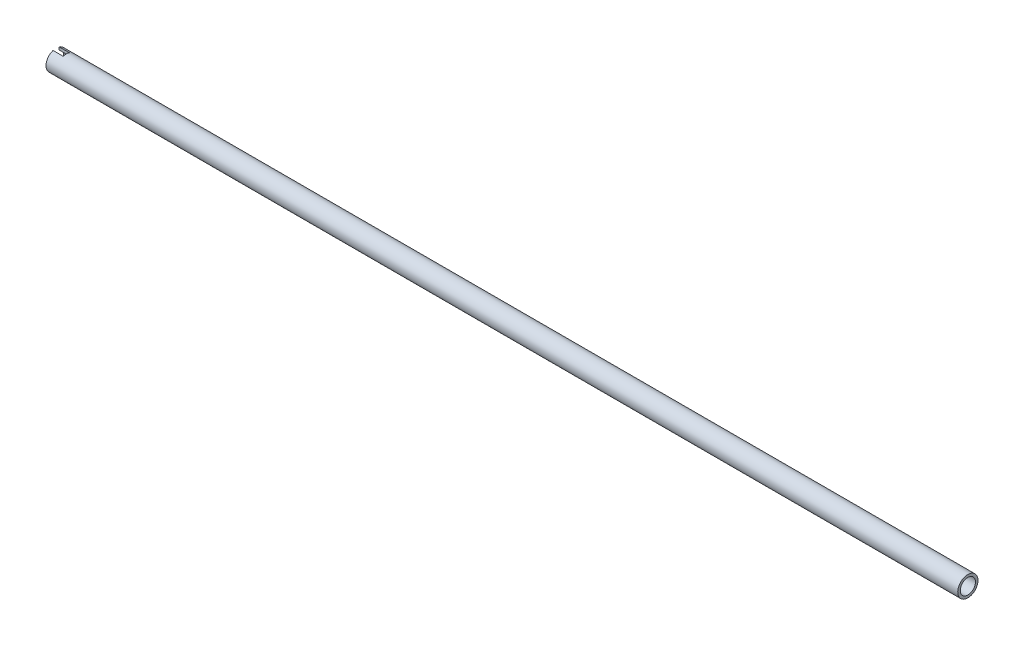
ISO-10303-21;
HEADER;
FILE_DESCRIPTION(('STEP AP214'),'2;1');
FILE_NAME('part.step','',(''),(''),'','','');
FILE_SCHEMA(('AUTOMOTIVE_DESIGN { 1 0 10303 214 1 1 1 1 }'));
ENDSEC;
DATA;
#1=APPLICATION_CONTEXT('core data for automotive mechanical design processes');
#2=APPLICATION_PROTOCOL_DEFINITION('international standard','automotive_design',2000,#1);
#3=PRODUCT_CONTEXT('',#1,'mechanical');
#4=PRODUCT('Part','Part','',(#3));
#5=PRODUCT_RELATED_PRODUCT_CATEGORY('part','',(#4));
#6=PRODUCT_DEFINITION_FORMATION('','',#4);
#7=PRODUCT_DEFINITION_CONTEXT('part definition',#1,'design');
#8=PRODUCT_DEFINITION('design','',#6,#7);
#9=PRODUCT_DEFINITION_SHAPE('','',#8);
#10=(LENGTH_UNIT() NAMED_UNIT(*) SI_UNIT(.MILLI.,.METRE.));
#11=(NAMED_UNIT(*) PLANE_ANGLE_UNIT() SI_UNIT($,.RADIAN.));
#12=(NAMED_UNIT(*) SI_UNIT($,.STERADIAN.) SOLID_ANGLE_UNIT());
#13=UNCERTAINTY_MEASURE_WITH_UNIT(LENGTH_MEASURE(1.E-05),#10,'distance_accuracy_value','');
#14=(GEOMETRIC_REPRESENTATION_CONTEXT(3) GLOBAL_UNCERTAINTY_ASSIGNED_CONTEXT((#13)) GLOBAL_UNIT_ASSIGNED_CONTEXT((#10,
#11,#12)) REPRESENTATION_CONTEXT('',''));
#15=CARTESIAN_POINT('',(0.,0.,0.));
#16=DIRECTION('',(0.,0.,1.));
#17=DIRECTION('',(1.,0.,0.));
#18=AXIS2_PLACEMENT_3D('',#15,#16,#17);
#19=CARTESIAN_POINT('',(90.,0.,0.));
#20=DIRECTION('',(1.,0.,0.));
#21=DIRECTION('',(0.,0.,-1.));
#22=AXIS2_PLACEMENT_3D('',#19,#20,#21);
#23=PLANE('',#22);
#24=CARTESIAN_POINT('',(90.,0.,0.));
#25=DIRECTION('',(1.,0.,0.));
#26=DIRECTION('',(0.,0.,-1.));
#27=AXIS2_PLACEMENT_3D('',#24,#25,#26);
#28=CIRCLE('',#27,1.);
#29=CARTESIAN_POINT('',(90.,0.,-1.));
#30=VERTEX_POINT('',#29);
#31=EDGE_CURVE('E101',#30,#30,#28,.T.);
#32=ORIENTED_EDGE('',*,*,#31,.T.);
#33=EDGE_LOOP('',(#32));
#34=FACE_BOUND('',#33,.T.);
#35=CARTESIAN_POINT('',(90.,0.,0.));
#36=DIRECTION('',(1.,0.,0.));
#37=DIRECTION('',(0.,0.,-1.));
#38=AXIS2_PLACEMENT_3D('',#35,#36,#37);
#39=CIRCLE('',#38,0.75);
#40=CARTESIAN_POINT('',(90.,0.,-0.75));
#41=VERTEX_POINT('',#40);
#42=EDGE_CURVE('E93',#41,#41,#39,.T.);
#43=ORIENTED_EDGE('',*,*,#42,.F.);
#44=EDGE_LOOP('',(#43));
#45=FACE_BOUND('',#44,.T.);
#46=ADVANCED_FACE('F33',(#34,#45),#23,.T.);
#47=CARTESIAN_POINT('',(0.,0.,0.));
#48=DIRECTION('',(1.,0.,0.));
#49=DIRECTION('',(0.,0.,-1.));
#50=AXIS2_PLACEMENT_3D('',#47,#48,#49);
#51=PLANE('',#50);
#52=CARTESIAN_POINT('',(0.,0.,0.));
#53=DIRECTION('',(1.,0.,0.));
#54=DIRECTION('',(0.,0.,-1.));
#55=AXIS2_PLACEMENT_3D('',#52,#53,#54);
#56=CIRCLE('',#55,0.75);
#57=CARTESIAN_POINT('',(0.,0.685626720599482,0.304));
#58=VERTEX_POINT('',#57);
#59=CARTESIAN_POINT('',(0.,0.685626720599482,-0.304));
#60=VERTEX_POINT('',#59);
#61=EDGE_CURVE('E85',#58,#60,#56,.T.);
#62=ORIENTED_EDGE('',*,*,#61,.T.);
#63=DIRECTION('',(0.,-1.,0.));
#64=VECTOR('',#63,1.);
#65=CARTESIAN_POINT('',(0.,0.610565491882027,-0.304));
#66=LINE('',#65,#64);
#67=CARTESIAN_POINT('',(0.,0.952672031708709,-0.304));
#68=VERTEX_POINT('',#67);
#69=EDGE_CURVE('E88',#68,#60,#66,.T.);
#70=ORIENTED_EDGE('',*,*,#69,.F.);
#71=CARTESIAN_POINT('',(0.,0.,0.));
#72=DIRECTION('',(1.,0.,0.));
#73=DIRECTION('',(0.,0.,-1.));
#74=AXIS2_PLACEMENT_3D('',#71,#72,#73);
#75=CIRCLE('',#74,1.);
#76=CARTESIAN_POINT('',(0.,0.952672031708709,0.304));
#77=VERTEX_POINT('',#76);
#78=EDGE_CURVE('E87',#77,#68,#75,.T.);
#79=ORIENTED_EDGE('',*,*,#78,.F.);
#80=DIRECTION('',(0.,1.,0.));
#81=VECTOR('',#80,1.);
#82=CARTESIAN_POINT('',(0.,1.09920253711593,0.304));
#83=LINE('',#82,#81);
#84=EDGE_CURVE('E74',#58,#77,#83,.T.);
#85=ORIENTED_EDGE('',*,*,#84,.F.);
#86=EDGE_LOOP('',(#62,#70,#79,#85));
#87=FACE_BOUND('',#86,.T.);
#88=ADVANCED_FACE('F83',(#87),#51,.F.);
#89=CARTESIAN_POINT('',(90.,0.,0.));
#90=DIRECTION('',(-1.,0.,0.));
#91=DIRECTION('',(0.,0.,1.));
#92=AXIS2_PLACEMENT_3D('',#89,#90,#91);
#93=CYLINDRICAL_SURFACE('',#92,1.);
#94=ORIENTED_EDGE('',*,*,#78,.T.);
#95=DIRECTION('',(-1.,0.,0.));
#96=VECTOR('',#95,1.);
#97=CARTESIAN_POINT('',(90.,0.952672031708709,-0.304));
#98=LINE('',#97,#96);
#99=CARTESIAN_POINT('',(1.,0.952672031708709,-0.304));
#100=VERTEX_POINT('',#99);
#101=EDGE_CURVE('E94',#68,#100,#98,.F.);
#102=ORIENTED_EDGE('',*,*,#101,.T.);
#103=CARTESIAN_POINT('',(1.,0.,0.));
#104=DIRECTION('',(-1.,0.,0.));
#105=DIRECTION('',(0.,0.,1.));
#106=AXIS2_PLACEMENT_3D('',#103,#104,#105);
#107=CIRCLE('',#106,1.);
#108=CARTESIAN_POINT('',(1.,0.952672031708709,0.304));
#109=VERTEX_POINT('',#108);
#110=EDGE_CURVE('E107',#109,#100,#107,.T.);
#111=ORIENTED_EDGE('',*,*,#110,.F.);
#112=DIRECTION('',(-1.,0.,0.));
#113=VECTOR('',#112,1.);
#114=CARTESIAN_POINT('',(90.,0.952672031708709,0.304));
#115=LINE('',#114,#113);
#116=EDGE_CURVE('E55',#109,#77,#115,.T.);
#117=ORIENTED_EDGE('',*,*,#116,.T.);
#118=EDGE_LOOP('',(#94,#102,#111,#117));
#119=FACE_BOUND('',#118,.T.);
#120=ORIENTED_EDGE('',*,*,#31,.F.);
#121=EDGE_LOOP('',(#120));
#122=FACE_BOUND('',#121,.T.);
#123=ADVANCED_FACE('F35',(#119,#122),#93,.T.);
#124=CARTESIAN_POINT('',(90.,0.,0.));
#125=DIRECTION('',(-1.,0.,0.));
#126=DIRECTION('',(0.,0.,1.));
#127=AXIS2_PLACEMENT_3D('',#124,#125,#126);
#128=CYLINDRICAL_SURFACE('',#127,0.75);
#129=DIRECTION('',(-1.,0.,0.));
#130=VECTOR('',#129,1.);
#131=CARTESIAN_POINT('',(90.,0.685626720599482,-0.304));
#132=LINE('',#131,#130);
#133=CARTESIAN_POINT('',(1.,0.685626720599482,-0.304));
#134=VERTEX_POINT('',#133);
#135=EDGE_CURVE('E11',#60,#134,#132,.F.);
#136=ORIENTED_EDGE('',*,*,#135,.F.);
#137=ORIENTED_EDGE('',*,*,#61,.F.);
#138=DIRECTION('',(-1.,0.,0.));
#139=VECTOR('',#138,1.);
#140=CARTESIAN_POINT('',(90.,0.685626720599482,0.304));
#141=LINE('',#140,#139);
#142=CARTESIAN_POINT('',(1.,0.685626720599482,0.304));
#143=VERTEX_POINT('',#142);
#144=EDGE_CURVE('E41',#143,#58,#141,.T.);
#145=ORIENTED_EDGE('',*,*,#144,.F.);
#146=CARTESIAN_POINT('',(1.,0.,0.));
#147=DIRECTION('',(-1.,0.,0.));
#148=DIRECTION('',(0.,0.,1.));
#149=AXIS2_PLACEMENT_3D('',#146,#147,#148);
#150=CIRCLE('',#149,0.75);
#151=EDGE_CURVE('E79',#143,#134,#150,.T.);
#152=ORIENTED_EDGE('',*,*,#151,.T.);
#153=EDGE_LOOP('',(#136,#137,#145,#152));
#154=FACE_BOUND('',#153,.T.);
#155=ORIENTED_EDGE('',*,*,#42,.T.);
#156=EDGE_LOOP('',(#155));
#157=FACE_BOUND('',#156,.T.);
#158=ADVANCED_FACE('F91',(#154,#157),#128,.F.);
#159=CARTESIAN_POINT('',(1.,0.610565491882027,-0.304));
#160=DIRECTION('',(0.,0.,-1.));
#161=DIRECTION('',(-1.,0.,0.));
#162=AXIS2_PLACEMENT_3D('',#159,#160,#161);
#163=PLANE('',#162);
#164=ORIENTED_EDGE('',*,*,#69,.T.);
#165=ORIENTED_EDGE('',*,*,#135,.T.);
#166=DIRECTION('',(0.,-1.,0.));
#167=VECTOR('',#166,1.);
#168=CARTESIAN_POINT('',(1.,0.610565491882027,-0.304));
#169=LINE('',#168,#167);
#170=EDGE_CURVE('E48',#100,#134,#169,.T.);
#171=ORIENTED_EDGE('',*,*,#170,.F.);
#172=ORIENTED_EDGE('',*,*,#101,.F.);
#173=EDGE_LOOP('',(#164,#165,#171,#172));
#174=FACE_BOUND('',#173,.T.);
#175=ADVANCED_FACE('F116',(#174),#163,.F.);
#176=CARTESIAN_POINT('',(1.,1.09920253711593,0.304));
#177=DIRECTION('',(0.,0.,1.));
#178=DIRECTION('',(1.,0.,0.));
#179=AXIS2_PLACEMENT_3D('',#176,#177,#178);
#180=PLANE('',#179);
#181=DIRECTION('',(0.,1.,0.));
#182=VECTOR('',#181,1.);
#183=CARTESIAN_POINT('',(1.,1.09920253711593,0.304));
#184=LINE('',#183,#182);
#185=EDGE_CURVE('E75',#143,#109,#184,.T.);
#186=ORIENTED_EDGE('',*,*,#185,.F.);
#187=ORIENTED_EDGE('',*,*,#144,.T.);
#188=ORIENTED_EDGE('',*,*,#84,.T.);
#189=ORIENTED_EDGE('',*,*,#116,.F.);
#190=EDGE_LOOP('',(#186,#187,#188,#189));
#191=FACE_BOUND('',#190,.T.);
#192=ADVANCED_FACE('F73',(#191),#180,.F.);
#193=CARTESIAN_POINT('',(1.,0.610565491882027,0.));
#194=DIRECTION('',(-1.,0.,0.));
#195=DIRECTION('',(0.,0.,1.));
#196=AXIS2_PLACEMENT_3D('',#193,#194,#195);
#197=PLANE('',#196);
#198=ORIENTED_EDGE('',*,*,#110,.T.);
#199=ORIENTED_EDGE('',*,*,#170,.T.);
#200=ORIENTED_EDGE('',*,*,#151,.F.);
#201=ORIENTED_EDGE('',*,*,#185,.T.);
#202=EDGE_LOOP('',(#198,#199,#200,#201));
#203=FACE_BOUND('',#202,.T.);
#204=ADVANCED_FACE('F105',(#203),#197,.T.);
#205=CLOSED_SHELL('',(#46,#88,#123,#158,#175,#192,#204));
#206=MANIFOLD_SOLID_BREP('B2',#205);
#207=ADVANCED_BREP_SHAPE_REPRESENTATION('',(#18,#206),#14);
#208=SHAPE_DEFINITION_REPRESENTATION(#9,#207);
ENDSEC;
END-ISO-10303-21;
